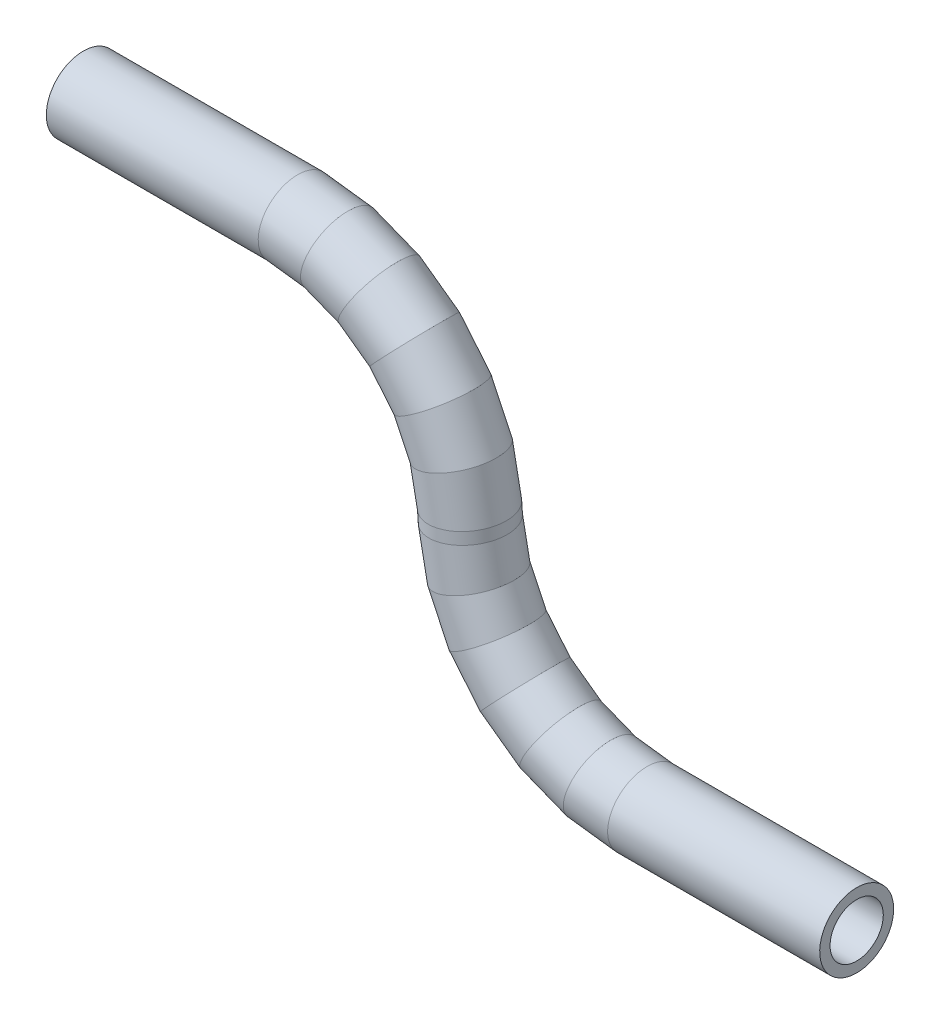
ISO-10303-21;
HEADER;
FILE_DESCRIPTION(('STEP AP214'),'2;1');
FILE_NAME('part.step','',(''),(''),'','','');
FILE_SCHEMA(('AUTOMOTIVE_DESIGN { 1 0 10303 214 1 1 1 1 }'));
ENDSEC;
DATA;
#1=APPLICATION_CONTEXT('core data for automotive mechanical design processes');
#2=APPLICATION_PROTOCOL_DEFINITION('international standard','automotive_design',2000,#1);
#3=PRODUCT_CONTEXT('',#1,'mechanical');
#4=PRODUCT('Part','Part','',(#3));
#5=PRODUCT_RELATED_PRODUCT_CATEGORY('part','',(#4));
#6=PRODUCT_DEFINITION_FORMATION('','',#4);
#7=PRODUCT_DEFINITION_CONTEXT('part definition',#1,'design');
#8=PRODUCT_DEFINITION('design','',#6,#7);
#9=PRODUCT_DEFINITION_SHAPE('','',#8);
#10=(LENGTH_UNIT() NAMED_UNIT(*) SI_UNIT(.MILLI.,.METRE.));
#11=(NAMED_UNIT(*) PLANE_ANGLE_UNIT() SI_UNIT($,.RADIAN.));
#12=(NAMED_UNIT(*) SI_UNIT($,.STERADIAN.) SOLID_ANGLE_UNIT());
#13=UNCERTAINTY_MEASURE_WITH_UNIT(LENGTH_MEASURE(1.E-05),#10,'distance_accuracy_value','');
#14=(GEOMETRIC_REPRESENTATION_CONTEXT(3) GLOBAL_UNCERTAINTY_ASSIGNED_CONTEXT((#13)) GLOBAL_UNIT_ASSIGNED_CONTEXT((#10,
#11,#12)) REPRESENTATION_CONTEXT('',''));
#15=CARTESIAN_POINT('',(0.,0.,0.));
#16=DIRECTION('',(0.,0.,1.));
#17=DIRECTION('',(1.,0.,0.));
#18=AXIS2_PLACEMENT_3D('',#15,#16,#17);
#19=CARTESIAN_POINT('',(-2128.64961481554,61.9999999999993,0.));
#20=DIRECTION('',(-1.,0.,0.));
#21=DIRECTION('',(0.,0.,1.));
#22=AXIS2_PLACEMENT_3D('',#19,#20,#21);
#23=CYLINDRICAL_SURFACE('',#22,3.175);
#24=CARTESIAN_POINT('',(-2129.18796047896,61.9999999999995,0.));
#25=DIRECTION('',(-0.99803668420921,0.0626320762284469,0.));
#26=DIRECTION('',(0.0626320762284469,0.99803668420921,0.));
#27=AXIS2_PLACEMENT_3D('',#24,#25,#26);
#28=ELLIPSE('',#27,3.18124579009408,3.175);
#29=CARTESIAN_POINT('',(-2128.98871245013,65.1749999999995,0.));
#30=VERTEX_POINT('',#29);
#31=EDGE_CURVE('E45',#30,#30,#28,.T.);
#32=ORIENTED_EDGE('',*,*,#31,.T.);
#33=EDGE_LOOP('',(#32));
#34=FACE_BOUND('',#33,.T.);
#35=CARTESIAN_POINT('',(-2147.38796047896,61.9999999999993,0.));
#36=DIRECTION('',(1.,0.,0.));
#37=DIRECTION('',(0.,0.,-1.));
#38=AXIS2_PLACEMENT_3D('',#35,#36,#37);
#39=CIRCLE('',#38,3.175);
#40=CARTESIAN_POINT('',(-2147.38796047896,61.9999999999993,-3.175));
#41=VERTEX_POINT('',#40);
#42=EDGE_CURVE('E98',#41,#41,#39,.T.);
#43=ORIENTED_EDGE('',*,*,#42,.T.);
#44=EDGE_LOOP('',(#43));
#45=FACE_BOUND('',#44,.T.);
#46=ADVANCED_FACE('F39',(#34,#45),#23,.T.);
#47=CARTESIAN_POINT('',(-2124.49437130654,61.4085757886626,0.));
#48=DIRECTION('',(-0.992154446054628,0.125018219368355,0.));
#49=DIRECTION('',(-0.125018219368355,-0.992154446054628,0.));
#50=AXIS2_PLACEMENT_3D('',#47,#48,#49);
#51=CYLINDRICAL_SURFACE('',#50,3.175);
#52=CARTESIAN_POINT('',(-2125.46683901343,61.5311133447788,0.));
#53=DIRECTION('',(-0.96874088965193,0.248074764368298,0.));
#54=DIRECTION('',(0.248074764368298,0.968740889651931,0.));
#55=AXIS2_PLACEMENT_3D('',#52,#53,#54);
#56=ELLIPSE('',#55,3.20010660903211,3.175);
#57=CARTESIAN_POINT('',(-2124.67297332044,64.6311874681936,0.));
#58=VERTEX_POINT('',#57);
#59=EDGE_CURVE('E137',#58,#58,#56,.T.);
#60=ORIENTED_EDGE('',*,*,#59,.T.);
#61=EDGE_LOOP('',(#60));
#62=FACE_BOUND('',#61,.T.);
#63=ORIENTED_EDGE('',*,*,#31,.F.);
#64=EDGE_LOOP('',(#63));
#65=FACE_BOUND('',#64,.T.);
#66=ADVANCED_FACE('F144',(#62,#65),#51,.T.);
#67=CARTESIAN_POINT('',(-2121.06668468475,59.7938155001374,0.));
#68=DIRECTION('',(-0.930126715431528,0.367238741475566,0.));
#69=DIRECTION('',(-0.367238741475566,-0.930126715431528,0.));
#70=AXIS2_PLACEMENT_3D('',#67,#68,#69);
#71=CYLINDRICAL_SURFACE('',#70,3.175);
#72=CARTESIAN_POINT('',(-2121.97835544093,60.1537673385084,0.));
#73=DIRECTION('',(-0.876917822567226,0.480640335868678,0.));
#74=DIRECTION('',(0.480640335868678,0.876917822567226,0.));
#75=AXIS2_PLACEMENT_3D('',#72,#73,#74);
#76=ELLIPSE('',#75,3.2001066090321,3.175);
#77=CARTESIAN_POINT('',(-2120.44025512555,62.9599978580838,0.));
#78=VERTEX_POINT('',#77);
#79=EDGE_CURVE('E131',#78,#78,#76,.T.);
#80=ORIENTED_EDGE('',*,*,#79,.T.);
#81=EDGE_LOOP('',(#80));
#82=FACE_BOUND('',#81,.T.);
#83=ORIENTED_EDGE('',*,*,#59,.F.);
#84=EDGE_LOOP('',(#83));
#85=FACE_BOUND('',#84,.T.);
#86=ADVANCED_FACE('F150',(#82,#85),#71,.T.);
#87=CARTESIAN_POINT('',(-2118.1467257754,57.3792086306286,0.));
#88=DIRECTION('',(-0.809949117537705,0.58650015089503,0.));
#89=DIRECTION('',(-0.58650015089503,-0.809949117537705,0.));
#90=AXIS2_PLACEMENT_3D('',#87,#88,#89);
#91=CYLINDRICAL_SURFACE('',#90,3.175);
#92=CARTESIAN_POINT('',(-2118.94060354732,57.9540712027831,0.));
#93=DIRECTION('',(-0.730271413518866,0.683157128775773,0.));
#94=DIRECTION('',(0.683157128775773,0.730271413518866,0.));
#95=AXIS2_PLACEMENT_3D('',#92,#93,#94);
#96=ELLIPSE('',#95,3.20010660903212,3.175);
#97=CARTESIAN_POINT('',(-2116.75442790452,60.291017579572,0.));
#98=VERTEX_POINT('',#97);
#99=EDGE_CURVE('E132',#98,#98,#96,.T.);
#100=ORIENTED_EDGE('',*,*,#99,.T.);
#101=EDGE_LOOP('',(#100));
#102=FACE_BOUND('',#101,.T.);
#103=ORIENTED_EDGE('',*,*,#79,.F.);
#104=EDGE_LOOP('',(#103));
#105=FACE_BOUND('',#104,.T.);
#106=ADVANCED_FACE('F155',(#102,#105),#91,.T.);
#107=CARTESIAN_POINT('',(-2115.91704521401,54.3157121052991,0.));
#108=DIRECTION('',(-0.639134941960971,0.769094614442558,0.));
#109=DIRECTION('',(-0.769094614442558,-0.639134941960971,0.));
#110=AXIS2_PLACEMENT_3D('',#107,#108,#109);
#111=CYLINDRICAL_SURFACE('',#110,3.175);
#112=CARTESIAN_POINT('',(-2116.54349817592,55.0695460260816,0.));
#113=DIRECTION('',(-0.537969735072089,0.842964153535882,0.));
#114=DIRECTION('',(0.842964153535882,0.537969735072089,0.));
#115=AXIS2_PLACEMENT_3D('',#112,#113,#114);
#116=ELLIPSE('',#115,3.20010660903208,3.175);
#117=CARTESIAN_POINT('',(-2113.84592301701,56.7911065307451,0.));
#118=VERTEX_POINT('',#117);
#119=EDGE_CURVE('E126',#118,#118,#116,.T.);
#120=ORIENTED_EDGE('',*,*,#119,.T.);
#121=EDGE_LOOP('',(#120));
#122=FACE_BOUND('',#121,.T.);
#123=ORIENTED_EDGE('',*,*,#99,.F.);
#124=EDGE_LOOP('',(#123));
#125=FACE_BOUND('',#124,.T.);
#126=ADVANCED_FACE('F266',(#122,#125),#111,.T.);
#127=CARTESIAN_POINT('',(-2114.51703866199,50.7948502760209,0.));
#128=DIRECTION('',(-0.428363187028244,0.903606651148056,0.));
#129=DIRECTION('',(-0.903606651148057,-0.428363187028244,0.));
#130=AXIS2_PLACEMENT_3D('',#127,#128,#129);
#131=CYLINDRICAL_SURFACE('',#130,3.175);
#132=CARTESIAN_POINT('',(-2114.93690208936,51.6805271900036,0.));
#133=DIRECTION('',(-0.312035146000277,0.9500705593063,0.));
#134=DIRECTION('',(0.9500705593063,0.312035146000277,0.));
#135=AXIS2_PLACEMENT_3D('',#132,#133,#134);
#136=ELLIPSE('',#135,3.2001066090321,3.175);
#137=CARTESIAN_POINT('',(-2111.89657501348,52.6790729229694,0.));
#138=VERTEX_POINT('',#137);
#139=EDGE_CURVE('E123',#138,#138,#136,.T.);
#140=ORIENTED_EDGE('',*,*,#139,.T.);
#141=EDGE_LOOP('',(#140));
#142=FACE_BOUND('',#141,.T.);
#143=ORIENTED_EDGE('',*,*,#119,.F.);
#144=EDGE_LOOP('',(#143));
#145=FACE_BOUND('',#144,.T.);
#146=ADVANCED_FACE('F265',(#142,#145),#131,.T.);
#147=CARTESIAN_POINT('',(-2114.11853458083,47.4704355870044,0.));
#148=DIRECTION('',(-0.190810927830717,0.981626807814651,0.));
#149=DIRECTION('',(-0.981626807814651,-0.190810927830717,0.));
#150=AXIS2_PLACEMENT_3D('',#147,#148,#149);
#151=CYLINDRICAL_SURFACE('',#150,3.175);
#152=CARTESIAN_POINT('',(-2114.22125681636,47.9988901220866,0.));
#153=DIRECTION('',(-0.128954980668212,0.991650448979307,0.));
#154=DIRECTION('',(0.991650448979307,0.128954980668212,0.));
#155=AXIS2_PLACEMENT_3D('',#152,#153,#154);
#156=ELLIPSE('',#155,3.18124579009406,3.175);
#157=CARTESIAN_POINT('',(-2111.0665730003,48.409127611449,0.));
#158=VERTEX_POINT('',#157);
#159=EDGE_CURVE('E124',#158,#158,#156,.T.);
#160=ORIENTED_EDGE('',*,*,#159,.T.);
#161=EDGE_LOOP('',(#160));
#162=FACE_BOUND('',#161,.T.);
#163=ORIENTED_EDGE('',*,*,#139,.F.);
#164=EDGE_LOOP('',(#163));
#165=FACE_BOUND('',#164,.T.);
#166=ADVANCED_FACE('F256',(#162,#165),#151,.T.);
#167=CARTESIAN_POINT('',(-2114.11881426386,46.4639592104197,0.));
#168=DIRECTION('',(-0.0665926748060159,0.997780244173125,0.));
#169=DIRECTION('',(-0.997780244173125,-0.0665926748060159,0.));
#170=AXIS2_PLACEMENT_3D('',#167,#168,#169);
#171=CYLINDRICAL_SURFACE('',#170,3.175);
#172=CARTESIAN_POINT('',(-2114.15466414155,47.0011098779134,0.));
#173=DIRECTION('',(-0.128954980668155,0.991650448979314,0.));
#174=DIRECTION('',(-0.991650448979315,-0.128954980668155,0.));
#175=AXIS2_PLACEMENT_3D('',#172,#173,#174);
#176=ELLIPSE('',#175,3.18124579009405,3.175);
#177=CARTESIAN_POINT('',(-2117.30934795762,46.5908723885512,0.));
#178=VERTEX_POINT('',#177);
#179=EDGE_CURVE('E116',#178,#178,#176,.T.);
#180=ORIENTED_EDGE('',*,*,#179,.T.);
#181=EDGE_LOOP('',(#180));
#182=FACE_BOUND('',#181,.T.);
#183=ORIENTED_EDGE('',*,*,#159,.F.);
#184=EDGE_LOOP('',(#183));
#185=FACE_BOUND('',#184,.T.);
#186=ADVANCED_FACE('F255',(#182,#185),#171,.T.);
#187=CARTESIAN_POINT('',(-2113.25199409013,42.3573238475874,0.));
#188=DIRECTION('',(-0.190810927830602,0.981626807814673,0.));
#189=DIRECTION('',(-0.981626807814673,-0.190810927830602,0.));
#190=AXIS2_PLACEMENT_3D('',#187,#188,#189);
#191=CYLINDRICAL_SURFACE('',#190,3.175);
#192=CARTESIAN_POINT('',(-2113.43901886855,43.3194728099965,0.));
#193=DIRECTION('',(-0.312035146000222,0.950070559306318,0.));
#194=DIRECTION('',(-0.950070559306318,-0.312035146000222,0.));
#195=AXIS2_PLACEMENT_3D('',#192,#193,#194);
#196=ELLIPSE('',#195,3.20010660903212,3.175);
#197=CARTESIAN_POINT('',(-2116.47934594444,42.3209270770309,0.));
#198=VERTEX_POINT('',#197);
#199=EDGE_CURVE('E117',#198,#198,#196,.T.);
#200=ORIENTED_EDGE('',*,*,#199,.T.);
#201=EDGE_LOOP('',(#200));
#202=FACE_BOUND('',#201,.T.);
#203=ORIENTED_EDGE('',*,*,#179,.F.);
#204=EDGE_LOOP('',(#203));
#205=FACE_BOUND('',#204,.T.);
#206=ADVANCED_FACE('F248',(#202,#205),#191,.T.);
#207=CARTESIAN_POINT('',(-2111.41255935462,39.0447770599363,0.));
#208=DIRECTION('',(-0.428363187028244,0.903606651148056,0.));
#209=DIRECTION('',(-0.903606651148057,-0.428363187028244,0.));
#210=AXIS2_PLACEMENT_3D('',#207,#208,#209);
#211=CYLINDRICAL_SURFACE('',#210,3.175);
#212=CARTESIAN_POINT('',(-2111.832422782,39.9304539739185,0.));
#213=DIRECTION('',(-0.537969735072089,0.842964153535882,0.));
#214=DIRECTION('',(-0.842964153535882,-0.537969735072089,0.));
#215=AXIS2_PLACEMENT_3D('',#212,#213,#214);
#216=ELLIPSE('',#215,3.20010660903208,3.175);
#217=CARTESIAN_POINT('',(-2114.5299979409,38.2088934692551,0.));
#218=VERTEX_POINT('',#217);
#219=EDGE_CURVE('E114',#218,#218,#216,.T.);
#220=ORIENTED_EDGE('',*,*,#219,.T.);
#221=EDGE_LOOP('',(#220));
#222=FACE_BOUND('',#221,.T.);
#223=ORIENTED_EDGE('',*,*,#199,.F.);
#224=EDGE_LOOP('',(#223));
#225=FACE_BOUND('',#224,.T.);
#226=ADVANCED_FACE('F247',(#222,#225),#211,.T.);
#227=CARTESIAN_POINT('',(-2108.80886444868,36.292094876434,0.));
#228=DIRECTION('',(-0.63913494196097,0.769094614442558,0.));
#229=DIRECTION('',(-0.769094614442558,-0.63913494196097,0.));
#230=AXIS2_PLACEMENT_3D('',#227,#228,#229);
#231=CYLINDRICAL_SURFACE('',#230,3.175);
#232=CARTESIAN_POINT('',(-2109.43531741059,37.0459287972163,0.));
#233=DIRECTION('',(-0.73027141351889,0.683157128775747,0.));
#234=DIRECTION('',(-0.683157128775747,-0.73027141351889,0.));
#235=AXIS2_PLACEMENT_3D('',#232,#233,#234);
#236=ELLIPSE('',#235,3.20010660903213,3.175);
#237=CARTESIAN_POINT('',(-2111.6214930534,34.7089824204273,0.));
#238=VERTEX_POINT('',#237);
#239=EDGE_CURVE('E109',#238,#238,#236,.T.);
#240=ORIENTED_EDGE('',*,*,#239,.T.);
#241=EDGE_LOOP('',(#240));
#242=FACE_BOUND('',#241,.T.);
#243=ORIENTED_EDGE('',*,*,#219,.F.);
#244=EDGE_LOOP('',(#243));
#245=FACE_BOUND('',#244,.T.);
#246=ADVANCED_FACE('F245',(#242,#245),#231,.T.);
#247=CARTESIAN_POINT('',(-2105.60368774507,34.2713700893371,0.));
#248=DIRECTION('',(-0.809949117537746,0.586500150894974,0.));
#249=DIRECTION('',(-0.586500150894974,-0.809949117537746,0.));
#250=AXIS2_PLACEMENT_3D('',#247,#248,#249);
#251=CYLINDRICAL_SURFACE('',#250,3.175);
#252=CARTESIAN_POINT('',(-2106.39756551699,34.8462326614914,0.));
#253=DIRECTION('',(-0.876917822567243,0.480640335868647,0.));
#254=DIRECTION('',(-0.480640335868647,-0.876917822567243,0.));
#255=AXIS2_PLACEMENT_3D('',#252,#253,#254);
#256=ELLIPSE('',#255,3.20010660903209,3.175);
#257=CARTESIAN_POINT('',(-2107.93566583237,32.0400021419159,0.));
#258=VERTEX_POINT('',#257);
#259=EDGE_CURVE('E110',#258,#258,#256,.T.);
#260=ORIENTED_EDGE('',*,*,#259,.T.);
#261=EDGE_LOOP('',(#260));
#262=FACE_BOUND('',#261,.T.);
#263=ORIENTED_EDGE('',*,*,#239,.F.);
#264=EDGE_LOOP('',(#263));
#265=FACE_BOUND('',#264,.T.);
#266=ADVANCED_FACE('F236',(#262,#265),#251,.T.);
#267=CARTESIAN_POINT('',(-2101.99741118831,33.10893481685,0.));
#268=DIRECTION('',(-0.930126715431528,0.367238741475566,0.));
#269=DIRECTION('',(-0.367238741475566,-0.930126715431528,0.));
#270=AXIS2_PLACEMENT_3D('',#267,#268,#269);
#271=CYLINDRICAL_SURFACE('',#270,3.175);
#272=CARTESIAN_POINT('',(-2102.90908194448,33.4688866552211,0.));
#273=DIRECTION('',(-0.96874088965193,0.248074764368298,0.));
#274=DIRECTION('',(-0.248074764368298,-0.968740889651931,0.));
#275=AXIS2_PLACEMENT_3D('',#272,#273,#274);
#276=ELLIPSE('',#275,3.2001066090321,3.175);
#277=CARTESIAN_POINT('',(-2103.70294763747,30.3688125318063,0.));
#278=VERTEX_POINT('',#277);
#279=EDGE_CURVE('E102',#278,#278,#276,.T.);
#280=ORIENTED_EDGE('',*,*,#279,.T.);
#281=EDGE_LOOP('',(#280));
#282=FACE_BOUND('',#281,.T.);
#283=ORIENTED_EDGE('',*,*,#259,.F.);
#284=EDGE_LOOP('',(#283));
#285=FACE_BOUND('',#284,.T.);
#286=ADVANCED_FACE('F231',(#282,#285),#271,.T.);
#287=CARTESIAN_POINT('',(-2098.65383843548,32.9326969837548,0.));
#288=DIRECTION('',(-0.992154446054628,0.125018219368355,0.));
#289=DIRECTION('',(-0.125018219368355,-0.992154446054628,0.));
#290=AXIS2_PLACEMENT_3D('',#287,#288,#289);
#291=CYLINDRICAL_SURFACE('',#290,3.175);
#292=CARTESIAN_POINT('',(-2099.18796047896,33.,0.));
#293=DIRECTION('',(-0.99803668420921,0.0626320762284468,0.));
#294=DIRECTION('',(-0.0626320762284469,-0.99803668420921,0.));
#295=AXIS2_PLACEMENT_3D('',#292,#293,#294);
#296=ELLIPSE('',#295,3.18124579009408,3.175);
#297=CARTESIAN_POINT('',(-2099.38720850779,29.825,0.));
#298=VERTEX_POINT('',#297);
#299=EDGE_CURVE('E101',#298,#298,#296,.T.);
#300=ORIENTED_EDGE('',*,*,#299,.T.);
#301=EDGE_LOOP('',(#300));
#302=FACE_BOUND('',#301,.T.);
#303=ORIENTED_EDGE('',*,*,#279,.F.);
#304=EDGE_LOOP('',(#303));
#305=FACE_BOUND('',#304,.T.);
#306=ADVANCED_FACE('F228',(#302,#305),#291,.T.);
#307=CARTESIAN_POINT('',(-2080.98796047896,33.,0.));
#308=DIRECTION('',(-1.,0.,0.));
#309=DIRECTION('',(0.,0.,1.));
#310=AXIS2_PLACEMENT_3D('',#307,#308,#309);
#311=CYLINDRICAL_SURFACE('',#310,3.175);
#312=CARTESIAN_POINT('',(-2080.98796047896,33.,0.));
#313=DIRECTION('',(1.,0.,0.));
#314=DIRECTION('',(0.,0.,-1.));
#315=AXIS2_PLACEMENT_3D('',#312,#313,#314);
#316=CIRCLE('',#315,3.175);
#317=CARTESIAN_POINT('',(-2080.98796047896,33.,-3.175));
#318=VERTEX_POINT('',#317);
#319=EDGE_CURVE('E92',#318,#318,#316,.T.);
#320=ORIENTED_EDGE('',*,*,#319,.F.);
#321=EDGE_LOOP('',(#320));
#322=FACE_BOUND('',#321,.T.);
#323=ORIENTED_EDGE('',*,*,#299,.F.);
#324=EDGE_LOOP('',(#323));
#325=FACE_BOUND('',#324,.T.);
#326=ADVANCED_FACE('F227',(#322,#325),#311,.T.);
#327=CARTESIAN_POINT('',(-2147.38796047896,61.9999999999993,0.));
#328=DIRECTION('',(1.,0.,0.));
#329=DIRECTION('',(0.,0.,-1.));
#330=AXIS2_PLACEMENT_3D('',#327,#328,#329);
#331=PLANE('',#330);
#332=CARTESIAN_POINT('',(-2147.38796047896,61.9999999999993,0.));
#333=DIRECTION('',(1.,0.,0.));
#334=DIRECTION('',(0.,0.,-1.));
#335=AXIS2_PLACEMENT_3D('',#332,#333,#334);
#336=CIRCLE('',#335,2.286);
#337=CARTESIAN_POINT('',(-2147.38796047896,61.9999999999993,-2.286));
#338=VERTEX_POINT('',#337);
#339=EDGE_CURVE('E95',#338,#338,#336,.F.);
#340=ORIENTED_EDGE('',*,*,#339,.F.);
#341=EDGE_LOOP('',(#340));
#342=FACE_BOUND('',#341,.T.);
#343=ORIENTED_EDGE('',*,*,#42,.F.);
#344=EDGE_LOOP('',(#343));
#345=FACE_BOUND('',#344,.T.);
#346=ADVANCED_FACE('F225',(#342,#345),#331,.F.);
#347=CARTESIAN_POINT('',(-2080.98796047896,33.,0.));
#348=DIRECTION('',(1.,0.,0.));
#349=DIRECTION('',(0.,0.,-1.));
#350=AXIS2_PLACEMENT_3D('',#347,#348,#349);
#351=PLANE('',#350);
#352=CARTESIAN_POINT('',(-2080.98796047896,33.,0.));
#353=DIRECTION('',(1.,0.,0.));
#354=DIRECTION('',(0.,0.,-1.));
#355=AXIS2_PLACEMENT_3D('',#352,#353,#354);
#356=CIRCLE('',#355,2.286);
#357=CARTESIAN_POINT('',(-2080.98796047896,33.,-2.286));
#358=VERTEX_POINT('',#357);
#359=EDGE_CURVE('E46',#358,#358,#356,.F.);
#360=ORIENTED_EDGE('',*,*,#359,.T.);
#361=EDGE_LOOP('',(#360));
#362=FACE_BOUND('',#361,.T.);
#363=ORIENTED_EDGE('',*,*,#319,.T.);
#364=EDGE_LOOP('',(#363));
#365=FACE_BOUND('',#364,.T.);
#366=ADVANCED_FACE('F217',(#362,#365),#351,.T.);
#367=CARTESIAN_POINT('',(-2128.7723516013,61.9999999999993,0.));
#368=DIRECTION('',(-1.,0.,0.));
#369=DIRECTION('',(0.,0.,1.));
#370=AXIS2_PLACEMENT_3D('',#367,#368,#369);
#371=CYLINDRICAL_SURFACE('',#370,2.286);
#372=CARTESIAN_POINT('',(-2129.18796047896,61.9999999999995,0.));
#373=DIRECTION('',(-0.99803668420921,0.0626320762284469,0.));
#374=DIRECTION('',(0.0626320762284469,0.99803668420921,0.));
#375=AXIS2_PLACEMENT_3D('',#372,#373,#374);
#376=ELLIPSE('',#375,2.29049696886773,2.286);
#377=CARTESIAN_POINT('',(-2129.0445018982,64.2859999999995,0.));
#378=VERTEX_POINT('',#377);
#379=EDGE_CURVE('E90',#378,#378,#376,.F.);
#380=ORIENTED_EDGE('',*,*,#379,.T.);
#381=EDGE_LOOP('',(#380));
#382=FACE_BOUND('',#381,.T.);
#383=ORIENTED_EDGE('',*,*,#339,.T.);
#384=EDGE_LOOP('',(#383));
#385=FACE_BOUND('',#384,.T.);
#386=ADVANCED_FACE('F212',(#382,#385),#371,.F.);
#387=CARTESIAN_POINT('',(-2124.73888193998,61.4393857942327,0.));
#388=DIRECTION('',(-0.992154446054628,0.125018219368355,0.));
#389=DIRECTION('',(-0.125018219368355,-0.992154446054628,0.));
#390=AXIS2_PLACEMENT_3D('',#387,#388,#389);
#391=CYLINDRICAL_SURFACE('',#390,2.286);
#392=CARTESIAN_POINT('',(-2125.46683901343,61.5311133447786,0.));
#393=DIRECTION('',(-0.96874088965193,0.248074764368298,0.));
#394=DIRECTION('',(0.248074764368298,0.96874088965193,0.));
#395=AXIS2_PLACEMENT_3D('',#392,#393,#394);
#396=ELLIPSE('',#395,2.30407675850311,2.286);
#397=CARTESIAN_POINT('',(-2124.89525571448,63.7631667136373,0.));
#398=VERTEX_POINT('',#397);
#399=EDGE_CURVE('E88',#398,#398,#396,.F.);
#400=ORIENTED_EDGE('',*,*,#399,.T.);
#401=EDGE_LOOP('',(#400));
#402=FACE_BOUND('',#401,.T.);
#403=ORIENTED_EDGE('',*,*,#379,.F.);
#404=EDGE_LOOP('',(#403));
#405=FACE_BOUND('',#404,.T.);
#406=ADVANCED_FACE('F209',(#402,#405),#391,.F.);
#407=CARTESIAN_POINT('',(-2121.29590894845,59.8843193301197,0.));
#408=DIRECTION('',(-0.930126715431528,0.367238741475566,0.));
#409=DIRECTION('',(-0.367238741475566,-0.930126715431528,0.));
#410=AXIS2_PLACEMENT_3D('',#407,#408,#409);
#411=CYLINDRICAL_SURFACE('',#410,2.286);
#412=CARTESIAN_POINT('',(-2121.97835544093,60.1537673385082,0.));
#413=DIRECTION('',(-0.876917822567226,0.480640335868678,0.));
#414=DIRECTION('',(0.480640335868678,0.876917822567226,0.));
#415=AXIS2_PLACEMENT_3D('',#412,#413,#414);
#416=ELLIPSE('',#415,2.30407675850311,2.286);
#417=CARTESIAN_POINT('',(-2120.87092321385,62.1742533126025,0.));
#418=VERTEX_POINT('',#417);
#419=EDGE_CURVE('E85',#418,#418,#416,.F.);
#420=ORIENTED_EDGE('',*,*,#419,.T.);
#421=EDGE_LOOP('',(#420));
#422=FACE_BOUND('',#421,.T.);
#423=ORIENTED_EDGE('',*,*,#399,.F.);
#424=EDGE_LOOP('',(#423));
#425=FACE_BOUND('',#424,.T.);
#426=ADVANCED_FACE('F206',(#422,#425),#411,.F.);
#427=CARTESIAN_POINT('',(-2118.34633297625,57.5237481466069,0.));
#428=DIRECTION('',(-0.809949117537705,0.58650015089503,0.));
#429=DIRECTION('',(-0.58650015089503,-0.809949117537705,0.));
#430=AXIS2_PLACEMENT_3D('',#427,#428,#429);
#431=CYLINDRICAL_SURFACE('',#430,2.286);
#432=CARTESIAN_POINT('',(-2118.94060354732,57.954071202783,0.));
#433=DIRECTION('',(-0.730271413518866,0.683157128775773,0.));
#434=DIRECTION('',(0.683157128775773,0.730271413518866,0.));
#435=AXIS2_PLACEMENT_3D('',#432,#433,#434);
#436=ELLIPSE('',#435,2.30407675850312,2.286);
#437=CARTESIAN_POINT('',(-2117.3665570845,59.636672594071,0.));
#438=VERTEX_POINT('',#437);
#439=EDGE_CURVE('E78',#438,#438,#436,.F.);
#440=ORIENTED_EDGE('',*,*,#439,.T.);
#441=EDGE_LOOP('',(#440));
#442=FACE_BOUND('',#441,.T.);
#443=ORIENTED_EDGE('',*,*,#419,.F.);
#444=EDGE_LOOP('',(#443));
#445=FACE_BOUND('',#444,.T.);
#446=ADVANCED_FACE('F205',(#442,#445),#431,.F.);
#447=CARTESIAN_POINT('',(-2116.07455626497,54.5052509539137,0.));
#448=DIRECTION('',(-0.63913494196097,0.769094614442558,0.));
#449=DIRECTION('',(-0.769094614442558,-0.63913494196097,0.));
#450=AXIS2_PLACEMENT_3D('',#447,#448,#449);
#451=CYLINDRICAL_SURFACE('',#450,2.286);
#452=CARTESIAN_POINT('',(-2116.54349817592,55.0695460260817,0.));
#453=DIRECTION('',(-0.537969735072089,0.842964153535882,0.));
#454=DIRECTION('',(0.842964153535882,0.537969735072089,0.));
#455=AXIS2_PLACEMENT_3D('',#452,#453,#454);
#456=ELLIPSE('',#455,2.3040767585031,2.286);
#457=CARTESIAN_POINT('',(-2114.60124406151,56.3090695894393,0.));
#458=VERTEX_POINT('',#457);
#459=EDGE_CURVE('E80',#458,#458,#456,.F.);
#460=ORIENTED_EDGE('',*,*,#459,.T.);
#461=EDGE_LOOP('',(#460));
#462=FACE_BOUND('',#461,.T.);
#463=ORIENTED_EDGE('',*,*,#439,.F.);
#464=EDGE_LOOP('',(#463));
#465=FACE_BOUND('',#464,.T.);
#466=ADVANCED_FACE('F196',(#462,#465),#451,.F.);
#467=CARTESIAN_POINT('',(-2114.62260625242,51.0175388257039,0.));
#468=DIRECTION('',(-0.428363187028244,0.903606651148056,0.));
#469=DIRECTION('',(-0.903606651148056,-0.428363187028244,0.));
#470=AXIS2_PLACEMENT_3D('',#467,#468,#469);
#471=CYLINDRICAL_SURFACE('',#470,2.286);
#472=CARTESIAN_POINT('',(-2114.93690208936,51.6805271900036,0.));
#473=DIRECTION('',(-0.312035146000277,0.9500705593063,0.));
#474=DIRECTION('',(0.9500705593063,0.312035146000277,0.));
#475=AXIS2_PLACEMENT_3D('',#472,#473,#474);
#476=ELLIPSE('',#475,2.30407675850311,2.286);
#477=CARTESIAN_POINT('',(-2112.74786659473,52.399480117739,0.));
#478=VERTEX_POINT('',#477);
#479=EDGE_CURVE('E74',#478,#478,#476,.F.);
#480=ORIENTED_EDGE('',*,*,#479,.T.);
#481=EDGE_LOOP('',(#480));
#482=FACE_BOUND('',#481,.T.);
#483=ORIENTED_EDGE('',*,*,#459,.F.);
#484=EDGE_LOOP('',(#483));
#485=FACE_BOUND('',#484,.T.);
#486=ADVANCED_FACE('F191',(#482,#485),#471,.F.);
#487=CARTESIAN_POINT('',(-2114.1419541008,47.5909173062088,0.));
#488=DIRECTION('',(-0.190810927830717,0.981626807814651,0.));
#489=DIRECTION('',(-0.981626807814651,-0.190810927830717,0.));
#490=AXIS2_PLACEMENT_3D('',#487,#488,#489);
#491=CYLINDRICAL_SURFACE('',#490,2.286);
#492=CARTESIAN_POINT('',(-2114.22125681636,47.9988901220866,0.));
#493=DIRECTION('',(-0.128954980668212,0.991650448979307,0.));
#494=DIRECTION('',(0.991650448979307,0.128954980668212,0.));
#495=AXIS2_PLACEMENT_3D('',#492,#493,#494);
#496=ELLIPSE('',#495,2.29049696886772,2.286);
#497=CARTESIAN_POINT('',(-2111.9498844688,48.2942611144275,0.));
#498=VERTEX_POINT('',#497);
#499=EDGE_CURVE('E72',#498,#498,#496,.F.);
#500=ORIENTED_EDGE('',*,*,#499,.T.);
#501=EDGE_LOOP('',(#500));
#502=FACE_BOUND('',#501,.T.);
#503=ORIENTED_EDGE('',*,*,#479,.F.);
#504=EDGE_LOOP('',(#503));
#505=FACE_BOUND('',#504,.T.);
#506=ADVANCED_FACE('F188',(#502,#505),#491,.F.);
#507=CARTESIAN_POINT('',(-2114.12698763472,46.5864235504809,0.));
#508=DIRECTION('',(-0.0665926748060159,0.997780244173125,0.));
#509=DIRECTION('',(-0.997780244173125,-0.0665926748060159,0.));
#510=AXIS2_PLACEMENT_3D('',#507,#508,#509);
#511=CYLINDRICAL_SURFACE('',#510,2.286);
#512=CARTESIAN_POINT('',(-2114.15466414156,47.0011098779134,0.));
#513=DIRECTION('',(-0.128954980668155,0.991650448979314,0.));
#514=DIRECTION('',(-0.991650448979314,-0.128954980668155,0.));
#515=AXIS2_PLACEMENT_3D('',#512,#513,#514);
#516=ELLIPSE('',#515,2.29049696886771,2.286);
#517=CARTESIAN_POINT('',(-2116.42603648912,46.7057388855726,0.));
#518=VERTEX_POINT('',#517);
#519=EDGE_CURVE('E70',#518,#518,#516,.F.);
#520=ORIENTED_EDGE('',*,*,#519,.T.);
#521=EDGE_LOOP('',(#520));
#522=FACE_BOUND('',#521,.T.);
#523=ORIENTED_EDGE('',*,*,#499,.F.);
#524=EDGE_LOOP('',(#523));
#525=FACE_BOUND('',#524,.T.);
#526=ADVANCED_FACE('F187',(#522,#525),#511,.F.);
#527=CARTESIAN_POINT('',(-2113.29901832211,42.5992400064428,0.));
#528=DIRECTION('',(-0.190810927830603,0.981626807814673,0.));
#529=DIRECTION('',(-0.981626807814673,-0.190810927830603,0.));
#530=AXIS2_PLACEMENT_3D('',#527,#528,#529);
#531=CYLINDRICAL_SURFACE('',#530,2.286);
#532=CARTESIAN_POINT('',(-2113.43901886855,43.3194728099965,0.));
#533=DIRECTION('',(-0.312035146000222,0.950070559306318,0.));
#534=DIRECTION('',(-0.950070559306318,-0.312035146000222,0.));
#535=AXIS2_PLACEMENT_3D('',#532,#533,#534);
#536=ELLIPSE('',#535,2.30407675850313,2.286);
#537=CARTESIAN_POINT('',(-2115.62805436319,42.6005198822613,0.));
#538=VERTEX_POINT('',#537);
#539=EDGE_CURVE('E63',#538,#538,#536,.F.);
#540=ORIENTED_EDGE('',*,*,#539,.T.);
#541=EDGE_LOOP('',(#540));
#542=FACE_BOUND('',#541,.T.);
#543=ORIENTED_EDGE('',*,*,#519,.F.);
#544=EDGE_LOOP('',(#543));
#545=FACE_BOUND('',#544,.T.);
#546=ADVANCED_FACE('F185',(#542,#545),#531,.F.);
#547=CARTESIAN_POINT('',(-2111.51812694505,39.267465609619,0.));
#548=DIRECTION('',(-0.428363187028244,0.903606651148056,0.));
#549=DIRECTION('',(-0.903606651148057,-0.428363187028244,0.));
#550=AXIS2_PLACEMENT_3D('',#547,#548,#549);
#551=CYLINDRICAL_SURFACE('',#550,2.286);
#552=CARTESIAN_POINT('',(-2111.832422782,39.9304539739186,0.));
#553=DIRECTION('',(-0.537969735072089,0.842964153535882,0.));
#554=DIRECTION('',(-0.842964153535882,-0.537969735072089,0.));
#555=AXIS2_PLACEMENT_3D('',#552,#553,#554);
#556=ELLIPSE('',#555,2.3040767585031,2.286);
#557=CARTESIAN_POINT('',(-2113.77467689641,38.6909304105609,0.));
#558=VERTEX_POINT('',#557);
#559=EDGE_CURVE('E65',#558,#558,#556,.F.);
#560=ORIENTED_EDGE('',*,*,#559,.T.);
#561=EDGE_LOOP('',(#560));
#562=FACE_BOUND('',#561,.T.);
#563=ORIENTED_EDGE('',*,*,#539,.F.);
#564=EDGE_LOOP('',(#563));
#565=FACE_BOUND('',#564,.T.);
#566=ADVANCED_FACE('F180',(#562,#565),#551,.F.);
#567=CARTESIAN_POINT('',(-2108.96637549964,36.4816337250486,0.));
#568=DIRECTION('',(-0.63913494196097,0.769094614442558,0.));
#569=DIRECTION('',(-0.769094614442558,-0.63913494196097,0.));
#570=AXIS2_PLACEMENT_3D('',#567,#568,#569);
#571=CYLINDRICAL_SURFACE('',#570,2.286);
#572=CARTESIAN_POINT('',(-2109.43531741059,37.0459287972166,0.));
#573=DIRECTION('',(-0.73027141351889,0.683157128775747,0.));
#574=DIRECTION('',(-0.683157128775747,-0.73027141351889,0.));
#575=AXIS2_PLACEMENT_3D('',#572,#573,#574);
#576=ELLIPSE('',#575,2.30407675850313,2.286);
#577=CARTESIAN_POINT('',(-2111.00936387341,35.3633274059285,0.));
#578=VERTEX_POINT('',#577);
#579=EDGE_CURVE('E56',#578,#578,#576,.F.);
#580=ORIENTED_EDGE('',*,*,#579,.T.);
#581=EDGE_LOOP('',(#580));
#582=FACE_BOUND('',#581,.T.);
#583=ORIENTED_EDGE('',*,*,#559,.F.);
#584=EDGE_LOOP('',(#583));
#585=FACE_BOUND('',#584,.T.);
#586=ADVANCED_FACE('F171',(#582,#585),#571,.F.);
#587=CARTESIAN_POINT('',(-2105.80329494592,34.4159096053154,0.));
#588=DIRECTION('',(-0.809949117537746,0.586500150894974,0.));
#589=DIRECTION('',(-0.586500150894974,-0.809949117537746,0.));
#590=AXIS2_PLACEMENT_3D('',#587,#588,#589);
#591=CYLINDRICAL_SURFACE('',#590,2.286);
#592=CARTESIAN_POINT('',(-2106.39756551699,34.8462326614915,0.));
#593=DIRECTION('',(-0.876917822567243,0.480640335868647,0.));
#594=DIRECTION('',(-0.480640335868647,-0.876917822567243,0.));
#595=AXIS2_PLACEMENT_3D('',#592,#593,#594);
#596=ELLIPSE('',#595,2.3040767585031,2.286);
#597=CARTESIAN_POINT('',(-2107.50499774406,32.8257466873971,0.));
#598=VERTEX_POINT('',#597);
#599=EDGE_CURVE('E57',#598,#598,#596,.F.);
#600=ORIENTED_EDGE('',*,*,#599,.T.);
#601=EDGE_LOOP('',(#600));
#602=FACE_BOUND('',#601,.T.);
#603=ORIENTED_EDGE('',*,*,#579,.F.);
#604=EDGE_LOOP('',(#603));
#605=FACE_BOUND('',#604,.T.);
#606=ADVANCED_FACE('F168',(#602,#605),#591,.F.);
#607=CARTESIAN_POINT('',(-2102.22663545201,33.1994386468327,0.));
#608=DIRECTION('',(-0.930126715431528,0.367238741475566,0.));
#609=DIRECTION('',(-0.367238741475566,-0.930126715431528,0.));
#610=AXIS2_PLACEMENT_3D('',#607,#608,#609);
#611=CYLINDRICAL_SURFACE('',#610,2.286);
#612=CARTESIAN_POINT('',(-2102.90908194448,33.4688866552211,0.));
#613=DIRECTION('',(-0.96874088965193,0.248074764368298,0.));
#614=DIRECTION('',(-0.248074764368298,-0.968740889651931,0.));
#615=AXIS2_PLACEMENT_3D('',#612,#613,#614);
#616=ELLIPSE('',#615,2.30407675850312,2.286);
#617=CARTESIAN_POINT('',(-2103.48066524343,31.2368332863624,0.));
#618=VERTEX_POINT('',#617);
#619=EDGE_CURVE('E51',#618,#618,#616,.F.);
#620=ORIENTED_EDGE('',*,*,#619,.T.);
#621=EDGE_LOOP('',(#620));
#622=FACE_BOUND('',#621,.T.);
#623=ORIENTED_EDGE('',*,*,#599,.F.);
#624=EDGE_LOOP('',(#623));
#625=FACE_BOUND('',#624,.T.);
#626=ADVANCED_FACE('F162',(#622,#625),#611,.F.);
#627=CARTESIAN_POINT('',(-2098.77561228317,32.9480413181611,0.));
#628=DIRECTION('',(-0.992154446054628,0.125018219368355,0.));
#629=DIRECTION('',(-0.125018219368355,-0.992154446054628,0.));
#630=AXIS2_PLACEMENT_3D('',#627,#628,#629);
#631=CYLINDRICAL_SURFACE('',#630,2.286);
#632=CARTESIAN_POINT('',(-2099.18796047896,33.,0.));
#633=DIRECTION('',(-0.99803668420921,0.0626320762284469,0.));
#634=DIRECTION('',(-0.0626320762284469,-0.99803668420921,0.));
#635=AXIS2_PLACEMENT_3D('',#632,#633,#634);
#636=ELLIPSE('',#635,2.29049696886773,2.286);
#637=CARTESIAN_POINT('',(-2099.33141905971,30.714,0.));
#638=VERTEX_POINT('',#637);
#639=EDGE_CURVE('E10',#638,#638,#636,.F.);
#640=ORIENTED_EDGE('',*,*,#639,.T.);
#641=EDGE_LOOP('',(#640));
#642=FACE_BOUND('',#641,.T.);
#643=ORIENTED_EDGE('',*,*,#619,.F.);
#644=EDGE_LOOP('',(#643));
#645=FACE_BOUND('',#644,.T.);
#646=ADVANCED_FACE('F160',(#642,#645),#631,.F.);
#647=CARTESIAN_POINT('',(-2080.98796047896,33.,0.));
#648=DIRECTION('',(-1.,0.,0.));
#649=DIRECTION('',(0.,0.,1.));
#650=AXIS2_PLACEMENT_3D('',#647,#648,#649);
#651=CYLINDRICAL_SURFACE('',#650,2.286);
#652=ORIENTED_EDGE('',*,*,#359,.F.);
#653=EDGE_LOOP('',(#652));
#654=FACE_BOUND('',#653,.T.);
#655=ORIENTED_EDGE('',*,*,#639,.F.);
#656=EDGE_LOOP('',(#655));
#657=FACE_BOUND('',#656,.T.);
#658=ADVANCED_FACE('F154',(#654,#657),#651,.F.);
#659=CLOSED_SHELL('',(#46,#66,#86,#106,#126,#146,#166,#186,#206,#226,#246,#266,#286,#306,#326,
#346,#366,#386,#406,#426,#446,#466,#486,#506,#526,#546,#566,#586,#606,#626,#646,#658));
#660=MANIFOLD_SOLID_BREP('B2',#659);
#661=ADVANCED_BREP_SHAPE_REPRESENTATION('',(#18,#660),#14);
#662=SHAPE_DEFINITION_REPRESENTATION(#9,#661);
ENDSEC;
END-ISO-10303-21;
